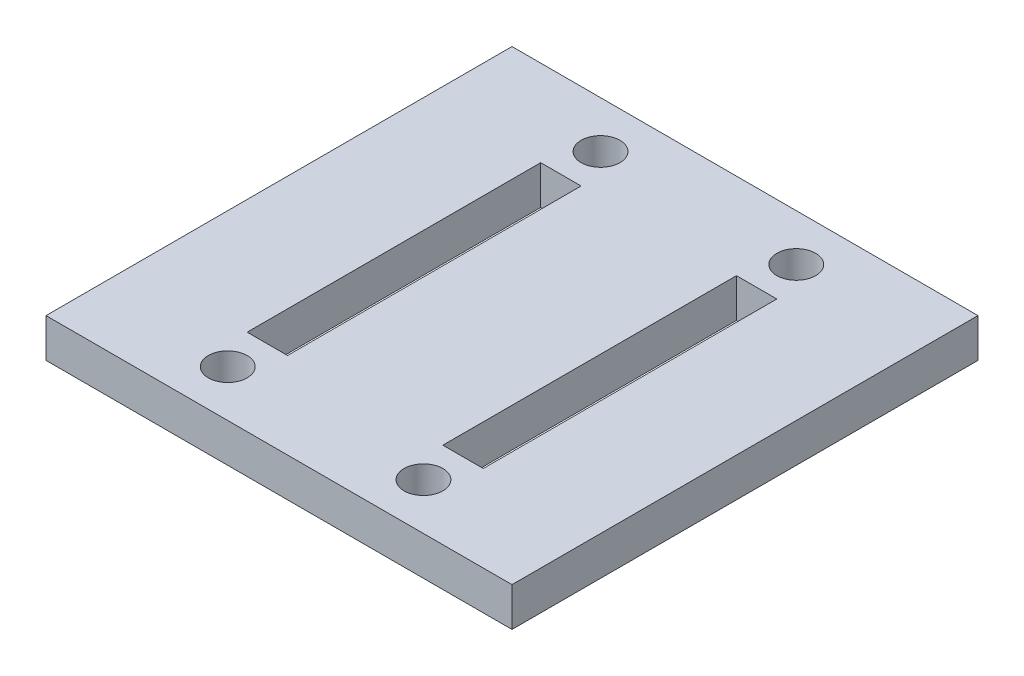
ISO-10303-21;
HEADER;
FILE_DESCRIPTION(('STEP AP214'),'2;1');
FILE_NAME('part.step','',(''),(''),'','','');
FILE_SCHEMA(('AUTOMOTIVE_DESIGN { 1 0 10303 214 1 1 1 1 }'));
ENDSEC;
DATA;
#1=APPLICATION_CONTEXT('core data for automotive mechanical design processes');
#2=APPLICATION_PROTOCOL_DEFINITION('international standard','automotive_design',2000,#1);
#3=PRODUCT_CONTEXT('',#1,'mechanical');
#4=PRODUCT('Part','Part','',(#3));
#5=PRODUCT_RELATED_PRODUCT_CATEGORY('part','',(#4));
#6=PRODUCT_DEFINITION_FORMATION('','',#4);
#7=PRODUCT_DEFINITION_CONTEXT('part definition',#1,'design');
#8=PRODUCT_DEFINITION('design','',#6,#7);
#9=PRODUCT_DEFINITION_SHAPE('','',#8);
#10=(LENGTH_UNIT() NAMED_UNIT(*) SI_UNIT(.MILLI.,.METRE.));
#11=(NAMED_UNIT(*) PLANE_ANGLE_UNIT() SI_UNIT($,.RADIAN.));
#12=(NAMED_UNIT(*) SI_UNIT($,.STERADIAN.) SOLID_ANGLE_UNIT());
#13=UNCERTAINTY_MEASURE_WITH_UNIT(LENGTH_MEASURE(1.E-05),#10,'distance_accuracy_value','');
#14=(GEOMETRIC_REPRESENTATION_CONTEXT(3) GLOBAL_UNCERTAINTY_ASSIGNED_CONTEXT((#13)) GLOBAL_UNIT_ASSIGNED_CONTEXT((#10,
#11,#12)) REPRESENTATION_CONTEXT('',''));
#15=CARTESIAN_POINT('',(0.,0.,0.));
#16=DIRECTION('',(0.,0.,1.));
#17=DIRECTION('',(1.,0.,0.));
#18=AXIS2_PLACEMENT_3D('',#15,#16,#17);
#19=CARTESIAN_POINT('',(38.1,6.35,-38.1));
#20=DIRECTION('',(0.,-1.,0.));
#21=DIRECTION('',(0.,0.,-1.));
#22=AXIS2_PLACEMENT_3D('',#19,#20,#21);
#23=PLANE('',#22);
#24=CARTESIAN_POINT('',(16.002,6.35,30.48));
#25=DIRECTION('',(0.,1.,0.));
#26=DIRECTION('',(0.,0.,1.));
#27=AXIS2_PLACEMENT_3D('',#24,#25,#26);
#28=CIRCLE('',#27,3.175);
#29=CARTESIAN_POINT('',(16.002,6.35,33.655));
#30=VERTEX_POINT('',#29);
#31=EDGE_CURVE('E327',#30,#30,#28,.T.);
#32=ORIENTED_EDGE('',*,*,#31,.F.);
#33=EDGE_LOOP('',(#32));
#34=FACE_BOUND('',#33,.T.);
#35=CARTESIAN_POINT('',(-16.002,6.35,-30.48));
#36=DIRECTION('',(0.,1.,0.));
#37=DIRECTION('',(0.,0.,1.));
#38=AXIS2_PLACEMENT_3D('',#35,#36,#37);
#39=CIRCLE('',#38,3.175);
#40=CARTESIAN_POINT('',(-16.002,6.35,-27.305));
#41=VERTEX_POINT('',#40);
#42=EDGE_CURVE('E150',#41,#41,#39,.T.);
#43=ORIENTED_EDGE('',*,*,#42,.F.);
#44=EDGE_LOOP('',(#43));
#45=FACE_BOUND('',#44,.T.);
#46=DIRECTION('',(0.,0.,-1.));
#47=VECTOR('',#46,1.);
#48=CARTESIAN_POINT('',(19.304,6.35,24.003));
#49=LINE('',#48,#47);
#50=CARTESIAN_POINT('',(19.304,6.35,24.003));
#51=VERTEX_POINT('',#50);
#52=CARTESIAN_POINT('',(19.304,6.35,-24.003));
#53=VERTEX_POINT('',#52);
#54=EDGE_CURVE('E160',#51,#53,#49,.T.);
#55=ORIENTED_EDGE('',*,*,#54,.F.);
#56=DIRECTION('',(1.,0.,0.));
#57=VECTOR('',#56,1.);
#58=CARTESIAN_POINT('',(12.7,6.35,24.003));
#59=LINE('',#58,#57);
#60=CARTESIAN_POINT('',(12.7,6.35,24.003));
#61=VERTEX_POINT('',#60);
#62=EDGE_CURVE('E168',#61,#51,#59,.T.);
#63=ORIENTED_EDGE('',*,*,#62,.F.);
#64=DIRECTION('',(0.,0.,1.));
#65=VECTOR('',#64,1.);
#66=CARTESIAN_POINT('',(12.7,6.35,24.003));
#67=LINE('',#66,#65);
#68=CARTESIAN_POINT('',(12.7,6.35,-24.003));
#69=VERTEX_POINT('',#68);
#70=EDGE_CURVE('E165',#69,#61,#67,.T.);
#71=ORIENTED_EDGE('',*,*,#70,.F.);
#72=DIRECTION('',(-1.,0.,0.));
#73=VECTOR('',#72,1.);
#74=CARTESIAN_POINT('',(12.7,6.35,-24.003));
#75=LINE('',#74,#73);
#76=EDGE_CURVE('E162',#53,#69,#75,.T.);
#77=ORIENTED_EDGE('',*,*,#76,.F.);
#78=EDGE_LOOP('',(#55,#63,#71,#77));
#79=FACE_BOUND('',#78,.T.);
#80=DIRECTION('',(0.,0.,-1.));
#81=VECTOR('',#80,1.);
#82=CARTESIAN_POINT('',(38.1,6.35,38.1));
#83=LINE('',#82,#81);
#84=CARTESIAN_POINT('',(38.1,6.35,38.1));
#85=VERTEX_POINT('',#84);
#86=CARTESIAN_POINT('',(38.1,6.35,-38.1));
#87=VERTEX_POINT('',#86);
#88=EDGE_CURVE('E191',#85,#87,#83,.T.);
#89=ORIENTED_EDGE('',*,*,#88,.T.);
#90=DIRECTION('',(-1.,0.,0.));
#91=VECTOR('',#90,1.);
#92=CARTESIAN_POINT('',(-38.1,6.35,-38.1));
#93=LINE('',#92,#91);
#94=CARTESIAN_POINT('',(-38.1,6.35,-38.1));
#95=VERTEX_POINT('',#94);
#96=EDGE_CURVE('E194',#87,#95,#93,.T.);
#97=ORIENTED_EDGE('',*,*,#96,.T.);
#98=DIRECTION('',(0.,0.,1.));
#99=VECTOR('',#98,1.);
#100=CARTESIAN_POINT('',(-38.1,6.35,38.1));
#101=LINE('',#100,#99);
#102=CARTESIAN_POINT('',(-38.1,6.35,38.1));
#103=VERTEX_POINT('',#102);
#104=EDGE_CURVE('E197',#95,#103,#101,.T.);
#105=ORIENTED_EDGE('',*,*,#104,.T.);
#106=DIRECTION('',(1.,0.,0.));
#107=VECTOR('',#106,1.);
#108=CARTESIAN_POINT('',(-38.1,6.35,38.1));
#109=LINE('',#108,#107);
#110=EDGE_CURVE('E199',#103,#85,#109,.T.);
#111=ORIENTED_EDGE('',*,*,#110,.T.);
#112=EDGE_LOOP('',(#89,#97,#105,#111));
#113=FACE_BOUND('',#112,.T.);
#114=DIRECTION('',(0.,0.,-1.));
#115=VECTOR('',#114,1.);
#116=CARTESIAN_POINT('',(-12.7,6.35,24.003));
#117=LINE('',#116,#115);
#118=CARTESIAN_POINT('',(-12.7,6.35,24.003));
#119=VERTEX_POINT('',#118);
#120=CARTESIAN_POINT('',(-12.7,6.35,-24.003));
#121=VERTEX_POINT('',#120);
#122=EDGE_CURVE('E121',#119,#121,#117,.T.);
#123=ORIENTED_EDGE('',*,*,#122,.F.);
#124=DIRECTION('',(1.,0.,0.));
#125=VECTOR('',#124,1.);
#126=CARTESIAN_POINT('',(-12.7,6.35,24.003));
#127=LINE('',#126,#125);
#128=CARTESIAN_POINT('',(-19.304,6.35,24.003));
#129=VERTEX_POINT('',#128);
#130=EDGE_CURVE('E144',#129,#119,#127,.T.);
#131=ORIENTED_EDGE('',*,*,#130,.F.);
#132=DIRECTION('',(0.,0.,1.));
#133=VECTOR('',#132,1.);
#134=CARTESIAN_POINT('',(-19.304,6.35,24.003));
#135=LINE('',#134,#133);
#136=CARTESIAN_POINT('',(-19.304,6.35,-24.003));
#137=VERTEX_POINT('',#136);
#138=EDGE_CURVE('E142',#137,#129,#135,.T.);
#139=ORIENTED_EDGE('',*,*,#138,.F.);
#140=DIRECTION('',(-1.,0.,0.));
#141=VECTOR('',#140,1.);
#142=CARTESIAN_POINT('',(-12.7,6.35,-24.003));
#143=LINE('',#142,#141);
#144=EDGE_CURVE('E129',#121,#137,#143,.T.);
#145=ORIENTED_EDGE('',*,*,#144,.F.);
#146=EDGE_LOOP('',(#123,#131,#139,#145));
#147=FACE_BOUND('',#146,.T.);
#148=CARTESIAN_POINT('',(-16.002,6.35,30.48));
#149=DIRECTION('',(0.,1.,0.));
#150=DIRECTION('',(0.,0.,-1.));
#151=AXIS2_PLACEMENT_3D('',#148,#149,#150);
#152=CIRCLE('',#151,3.175);
#153=CARTESIAN_POINT('',(-16.002,6.35,27.305));
#154=VERTEX_POINT('',#153);
#155=EDGE_CURVE('E333',#154,#154,#152,.T.);
#156=ORIENTED_EDGE('',*,*,#155,.F.);
#157=EDGE_LOOP('',(#156));
#158=FACE_BOUND('',#157,.T.);
#159=CARTESIAN_POINT('',(16.002,6.35,-30.48));
#160=DIRECTION('',(0.,1.,0.));
#161=DIRECTION('',(0.,0.,-1.));
#162=AXIS2_PLACEMENT_3D('',#159,#160,#161);
#163=CIRCLE('',#162,3.175);
#164=CARTESIAN_POINT('',(16.002,6.35,-33.655));
#165=VERTEX_POINT('',#164);
#166=EDGE_CURVE('E318',#165,#165,#163,.T.);
#167=ORIENTED_EDGE('',*,*,#166,.F.);
#168=EDGE_LOOP('',(#167));
#169=FACE_BOUND('',#168,.T.);
#170=ADVANCED_FACE('F32',(#34,#45,#79,#113,#147,#158,#169),#23,.F.);
#171=CARTESIAN_POINT('',(38.1,0.,-38.1));
#172=DIRECTION('',(0.,-1.,0.));
#173=DIRECTION('',(0.,0.,-1.));
#174=AXIS2_PLACEMENT_3D('',#171,#172,#173);
#175=PLANE('',#174);
#176=CARTESIAN_POINT('',(16.002,0.,30.48));
#177=DIRECTION('',(0.,1.,0.));
#178=DIRECTION('',(0.,0.,1.));
#179=AXIS2_PLACEMENT_3D('',#176,#177,#178);
#180=CIRCLE('',#179,3.175);
#181=CARTESIAN_POINT('',(16.002,0.,33.655));
#182=VERTEX_POINT('',#181);
#183=EDGE_CURVE('E324',#182,#182,#180,.T.);
#184=ORIENTED_EDGE('',*,*,#183,.T.);
#185=EDGE_LOOP('',(#184));
#186=FACE_BOUND('',#185,.T.);
#187=CARTESIAN_POINT('',(-16.002,0.,-30.48));
#188=DIRECTION('',(0.,1.,0.));
#189=DIRECTION('',(0.,0.,1.));
#190=AXIS2_PLACEMENT_3D('',#187,#188,#189);
#191=CIRCLE('',#190,3.175);
#192=CARTESIAN_POINT('',(-16.002,0.,-27.305));
#193=VERTEX_POINT('',#192);
#194=EDGE_CURVE('E336',#193,#193,#191,.T.);
#195=ORIENTED_EDGE('',*,*,#194,.T.);
#196=EDGE_LOOP('',(#195));
#197=FACE_BOUND('',#196,.T.);
#198=DIRECTION('',(1.,0.,0.));
#199=VECTOR('',#198,1.);
#200=CARTESIAN_POINT('',(12.7,0.,24.003));
#201=LINE('',#200,#199);
#202=CARTESIAN_POINT('',(12.7,0.,24.003));
#203=VERTEX_POINT('',#202);
#204=CARTESIAN_POINT('',(19.304,0.,24.003));
#205=VERTEX_POINT('',#204);
#206=EDGE_CURVE('E163',#203,#205,#201,.T.);
#207=ORIENTED_EDGE('',*,*,#206,.T.);
#208=DIRECTION('',(0.,0.,-1.));
#209=VECTOR('',#208,1.);
#210=CARTESIAN_POINT('',(19.304,0.,24.003));
#211=LINE('',#210,#209);
#212=CARTESIAN_POINT('',(19.304,0.,-24.003));
#213=VERTEX_POINT('',#212);
#214=EDGE_CURVE('E137',#205,#213,#211,.T.);
#215=ORIENTED_EDGE('',*,*,#214,.T.);
#216=DIRECTION('',(-1.,0.,0.));
#217=VECTOR('',#216,1.);
#218=CARTESIAN_POINT('',(12.7,0.,-24.003));
#219=LINE('',#218,#217);
#220=CARTESIAN_POINT('',(12.7,0.,-24.003));
#221=VERTEX_POINT('',#220);
#222=EDGE_CURVE('E173',#213,#221,#219,.T.);
#223=ORIENTED_EDGE('',*,*,#222,.T.);
#224=DIRECTION('',(0.,0.,1.));
#225=VECTOR('',#224,1.);
#226=CARTESIAN_POINT('',(12.7,0.,24.003));
#227=LINE('',#226,#225);
#228=EDGE_CURVE('E176',#221,#203,#227,.T.);
#229=ORIENTED_EDGE('',*,*,#228,.T.);
#230=EDGE_LOOP('',(#207,#215,#223,#229));
#231=FACE_BOUND('',#230,.T.);
#232=DIRECTION('',(0.,0.,-1.));
#233=VECTOR('',#232,1.);
#234=CARTESIAN_POINT('',(38.1,0.,38.1));
#235=LINE('',#234,#233);
#236=CARTESIAN_POINT('',(38.1,0.,38.1));
#237=VERTEX_POINT('',#236);
#238=CARTESIAN_POINT('',(38.1,0.,-38.1));
#239=VERTEX_POINT('',#238);
#240=EDGE_CURVE('E190',#237,#239,#235,.T.);
#241=ORIENTED_EDGE('',*,*,#240,.F.);
#242=DIRECTION('',(1.,0.,0.));
#243=VECTOR('',#242,1.);
#244=CARTESIAN_POINT('',(-38.1,0.,38.1));
#245=LINE('',#244,#243);
#246=CARTESIAN_POINT('',(-38.1,0.,38.1));
#247=VERTEX_POINT('',#246);
#248=EDGE_CURVE('E195',#247,#237,#245,.T.);
#249=ORIENTED_EDGE('',*,*,#248,.F.);
#250=DIRECTION('',(0.,0.,1.));
#251=VECTOR('',#250,1.);
#252=CARTESIAN_POINT('',(-38.1,0.,38.1));
#253=LINE('',#252,#251);
#254=CARTESIAN_POINT('',(-38.1,0.,-38.1));
#255=VERTEX_POINT('',#254);
#256=EDGE_CURVE('E206',#255,#247,#253,.T.);
#257=ORIENTED_EDGE('',*,*,#256,.F.);
#258=DIRECTION('',(-1.,0.,0.));
#259=VECTOR('',#258,1.);
#260=CARTESIAN_POINT('',(-38.1,0.,-38.1));
#261=LINE('',#260,#259);
#262=EDGE_CURVE('E204',#239,#255,#261,.T.);
#263=ORIENTED_EDGE('',*,*,#262,.F.);
#264=EDGE_LOOP('',(#241,#249,#257,#263));
#265=FACE_BOUND('',#264,.T.);
#266=DIRECTION('',(1.,0.,0.));
#267=VECTOR('',#266,1.);
#268=CARTESIAN_POINT('',(-12.7,0.,24.003));
#269=LINE('',#268,#267);
#270=CARTESIAN_POINT('',(-19.304,0.,24.003));
#271=VERTEX_POINT('',#270);
#272=CARTESIAN_POINT('',(-12.7,0.,24.003));
#273=VERTEX_POINT('',#272);
#274=EDGE_CURVE('E130',#271,#273,#269,.T.);
#275=ORIENTED_EDGE('',*,*,#274,.T.);
#276=DIRECTION('',(0.,0.,-1.));
#277=VECTOR('',#276,1.);
#278=CARTESIAN_POINT('',(-12.7,0.,24.003));
#279=LINE('',#278,#277);
#280=CARTESIAN_POINT('',(-12.7,0.,-24.003));
#281=VERTEX_POINT('',#280);
#282=EDGE_CURVE('E55',#273,#281,#279,.T.);
#283=ORIENTED_EDGE('',*,*,#282,.T.);
#284=DIRECTION('',(-1.,0.,0.));
#285=VECTOR('',#284,1.);
#286=CARTESIAN_POINT('',(-12.7,0.,-24.003));
#287=LINE('',#286,#285);
#288=CARTESIAN_POINT('',(-19.304,0.,-24.003));
#289=VERTEX_POINT('',#288);
#290=EDGE_CURVE('E136',#281,#289,#287,.T.);
#291=ORIENTED_EDGE('',*,*,#290,.T.);
#292=DIRECTION('',(0.,0.,1.));
#293=VECTOR('',#292,1.);
#294=CARTESIAN_POINT('',(-19.304,0.,24.003));
#295=LINE('',#294,#293);
#296=EDGE_CURVE('E152',#289,#271,#295,.T.);
#297=ORIENTED_EDGE('',*,*,#296,.T.);
#298=EDGE_LOOP('',(#275,#283,#291,#297));
#299=FACE_BOUND('',#298,.T.);
#300=CARTESIAN_POINT('',(-16.002,0.,30.48));
#301=DIRECTION('',(0.,1.,0.));
#302=DIRECTION('',(0.,0.,-1.));
#303=AXIS2_PLACEMENT_3D('',#300,#301,#302);
#304=CIRCLE('',#303,3.175);
#305=CARTESIAN_POINT('',(-16.002,0.,27.305));
#306=VERTEX_POINT('',#305);
#307=EDGE_CURVE('E330',#306,#306,#304,.T.);
#308=ORIENTED_EDGE('',*,*,#307,.T.);
#309=EDGE_LOOP('',(#308));
#310=FACE_BOUND('',#309,.T.);
#311=CARTESIAN_POINT('',(16.002,0.,-30.48));
#312=DIRECTION('',(0.,1.,0.));
#313=DIRECTION('',(0.,0.,-1.));
#314=AXIS2_PLACEMENT_3D('',#311,#312,#313);
#315=CIRCLE('',#314,3.175);
#316=CARTESIAN_POINT('',(16.002,0.,-33.655));
#317=VERTEX_POINT('',#316);
#318=EDGE_CURVE('E321',#317,#317,#315,.T.);
#319=ORIENTED_EDGE('',*,*,#318,.T.);
#320=EDGE_LOOP('',(#319));
#321=FACE_BOUND('',#320,.T.);
#322=ADVANCED_FACE('F224',(#186,#197,#231,#265,#299,#310,#321),#175,.T.);
#323=CARTESIAN_POINT('',(38.1,6.35,38.1));
#324=DIRECTION('',(-1.,0.,0.));
#325=DIRECTION('',(0.,0.,1.));
#326=AXIS2_PLACEMENT_3D('',#323,#324,#325);
#327=PLANE('',#326);
#328=ORIENTED_EDGE('',*,*,#240,.T.);
#329=DIRECTION('',(0.,-1.,0.));
#330=VECTOR('',#329,1.);
#331=CARTESIAN_POINT('',(38.1,6.35,-38.1));
#332=LINE('',#331,#330);
#333=EDGE_CURVE('E11',#87,#239,#332,.T.);
#334=ORIENTED_EDGE('',*,*,#333,.F.);
#335=ORIENTED_EDGE('',*,*,#88,.F.);
#336=DIRECTION('',(0.,-1.,0.));
#337=VECTOR('',#336,1.);
#338=CARTESIAN_POINT('',(38.1,6.35,38.1));
#339=LINE('',#338,#337);
#340=EDGE_CURVE('E201',#85,#237,#339,.T.);
#341=ORIENTED_EDGE('',*,*,#340,.T.);
#342=EDGE_LOOP('',(#328,#334,#335,#341));
#343=FACE_BOUND('',#342,.T.);
#344=ADVANCED_FACE('F34',(#343),#327,.F.);
#345=CARTESIAN_POINT('',(-38.1,6.35,-38.1));
#346=DIRECTION('',(0.,0.,1.));
#347=DIRECTION('',(1.,0.,0.));
#348=AXIS2_PLACEMENT_3D('',#345,#346,#347);
#349=PLANE('',#348);
#350=ORIENTED_EDGE('',*,*,#262,.T.);
#351=DIRECTION('',(0.,-1.,0.));
#352=VECTOR('',#351,1.);
#353=CARTESIAN_POINT('',(-38.1,6.35,-38.1));
#354=LINE('',#353,#352);
#355=EDGE_CURVE('E40',#95,#255,#354,.T.);
#356=ORIENTED_EDGE('',*,*,#355,.F.);
#357=ORIENTED_EDGE('',*,*,#96,.F.);
#358=ORIENTED_EDGE('',*,*,#333,.T.);
#359=EDGE_LOOP('',(#350,#356,#357,#358));
#360=FACE_BOUND('',#359,.T.);
#361=ADVANCED_FACE('F234',(#360),#349,.F.);
#362=CARTESIAN_POINT('',(-38.1,6.35,38.1));
#363=DIRECTION('',(1.,0.,0.));
#364=DIRECTION('',(0.,0.,-1.));
#365=AXIS2_PLACEMENT_3D('',#362,#363,#364);
#366=PLANE('',#365);
#367=ORIENTED_EDGE('',*,*,#256,.T.);
#368=DIRECTION('',(0.,-1.,0.));
#369=VECTOR('',#368,1.);
#370=CARTESIAN_POINT('',(-38.1,6.35,38.1));
#371=LINE('',#370,#369);
#372=EDGE_CURVE('E211',#103,#247,#371,.T.);
#373=ORIENTED_EDGE('',*,*,#372,.F.);
#374=ORIENTED_EDGE('',*,*,#104,.F.);
#375=ORIENTED_EDGE('',*,*,#355,.T.);
#376=EDGE_LOOP('',(#367,#373,#374,#375));
#377=FACE_BOUND('',#376,.T.);
#378=ADVANCED_FACE('F218',(#377),#366,.F.);
#379=CARTESIAN_POINT('',(-38.1,6.35,38.1));
#380=DIRECTION('',(0.,0.,-1.));
#381=DIRECTION('',(-1.,0.,0.));
#382=AXIS2_PLACEMENT_3D('',#379,#380,#381);
#383=PLANE('',#382);
#384=ORIENTED_EDGE('',*,*,#248,.T.);
#385=ORIENTED_EDGE('',*,*,#340,.F.);
#386=ORIENTED_EDGE('',*,*,#110,.F.);
#387=ORIENTED_EDGE('',*,*,#372,.T.);
#388=EDGE_LOOP('',(#384,#385,#386,#387));
#389=FACE_BOUND('',#388,.T.);
#390=ADVANCED_FACE('F228',(#389),#383,.F.);
#391=CARTESIAN_POINT('',(19.304,6.35,24.003));
#392=DIRECTION('',(-1.,0.,0.));
#393=DIRECTION('',(0.,0.,1.));
#394=AXIS2_PLACEMENT_3D('',#391,#392,#393);
#395=PLANE('',#394);
#396=ORIENTED_EDGE('',*,*,#214,.F.);
#397=DIRECTION('',(0.,-1.,0.));
#398=VECTOR('',#397,1.);
#399=CARTESIAN_POINT('',(19.304,6.35,24.003));
#400=LINE('',#399,#398);
#401=EDGE_CURVE('E170',#51,#205,#400,.T.);
#402=ORIENTED_EDGE('',*,*,#401,.F.);
#403=ORIENTED_EDGE('',*,*,#54,.T.);
#404=DIRECTION('',(0.,-1.,0.));
#405=VECTOR('',#404,1.);
#406=CARTESIAN_POINT('',(19.304,6.35,-24.003));
#407=LINE('',#406,#405);
#408=EDGE_CURVE('E187',#53,#213,#407,.T.);
#409=ORIENTED_EDGE('',*,*,#408,.T.);
#410=EDGE_LOOP('',(#396,#402,#403,#409));
#411=FACE_BOUND('',#410,.T.);
#412=ADVANCED_FACE('F252',(#411),#395,.T.);
#413=CARTESIAN_POINT('',(12.7,6.35,-24.003));
#414=DIRECTION('',(0.,0.,1.));
#415=DIRECTION('',(1.,0.,0.));
#416=AXIS2_PLACEMENT_3D('',#413,#414,#415);
#417=PLANE('',#416);
#418=ORIENTED_EDGE('',*,*,#222,.F.);
#419=ORIENTED_EDGE('',*,*,#408,.F.);
#420=ORIENTED_EDGE('',*,*,#76,.T.);
#421=DIRECTION('',(0.,-1.,0.));
#422=VECTOR('',#421,1.);
#423=CARTESIAN_POINT('',(12.7,6.35,-24.003));
#424=LINE('',#423,#422);
#425=EDGE_CURVE('E185',#69,#221,#424,.T.);
#426=ORIENTED_EDGE('',*,*,#425,.T.);
#427=EDGE_LOOP('',(#418,#419,#420,#426));
#428=FACE_BOUND('',#427,.T.);
#429=ADVANCED_FACE('F259',(#428),#417,.T.);
#430=CARTESIAN_POINT('',(12.7,6.35,24.003));
#431=DIRECTION('',(1.,0.,0.));
#432=DIRECTION('',(0.,0.,-1.));
#433=AXIS2_PLACEMENT_3D('',#430,#431,#432);
#434=PLANE('',#433);
#435=ORIENTED_EDGE('',*,*,#228,.F.);
#436=ORIENTED_EDGE('',*,*,#425,.F.);
#437=ORIENTED_EDGE('',*,*,#70,.T.);
#438=DIRECTION('',(0.,-1.,0.));
#439=VECTOR('',#438,1.);
#440=CARTESIAN_POINT('',(12.7,6.35,24.003));
#441=LINE('',#440,#439);
#442=EDGE_CURVE('E183',#61,#203,#441,.T.);
#443=ORIENTED_EDGE('',*,*,#442,.T.);
#444=EDGE_LOOP('',(#435,#436,#437,#443));
#445=FACE_BOUND('',#444,.T.);
#446=ADVANCED_FACE('F264',(#445),#434,.T.);
#447=CARTESIAN_POINT('',(12.7,6.35,24.003));
#448=DIRECTION('',(0.,0.,-1.));
#449=DIRECTION('',(-1.,0.,0.));
#450=AXIS2_PLACEMENT_3D('',#447,#448,#449);
#451=PLANE('',#450);
#452=ORIENTED_EDGE('',*,*,#206,.F.);
#453=ORIENTED_EDGE('',*,*,#442,.F.);
#454=ORIENTED_EDGE('',*,*,#62,.T.);
#455=ORIENTED_EDGE('',*,*,#401,.T.);
#456=EDGE_LOOP('',(#452,#453,#454,#455));
#457=FACE_BOUND('',#456,.T.);
#458=ADVANCED_FACE('F272',(#457),#451,.T.);
#459=CARTESIAN_POINT('',(-12.7,6.35,24.003));
#460=DIRECTION('',(-1.,0.,0.));
#461=DIRECTION('',(0.,0.,1.));
#462=AXIS2_PLACEMENT_3D('',#459,#460,#461);
#463=PLANE('',#462);
#464=ORIENTED_EDGE('',*,*,#282,.F.);
#465=DIRECTION('',(0.,-1.,0.));
#466=VECTOR('',#465,1.);
#467=CARTESIAN_POINT('',(-12.7,6.35,24.003));
#468=LINE('',#467,#466);
#469=EDGE_CURVE('E125',#119,#273,#468,.T.);
#470=ORIENTED_EDGE('',*,*,#469,.F.);
#471=ORIENTED_EDGE('',*,*,#122,.T.);
#472=DIRECTION('',(0.,-1.,0.));
#473=VECTOR('',#472,1.);
#474=CARTESIAN_POINT('',(-12.7,6.35,-24.003));
#475=LINE('',#474,#473);
#476=EDGE_CURVE('E124',#121,#281,#475,.T.);
#477=ORIENTED_EDGE('',*,*,#476,.T.);
#478=EDGE_LOOP('',(#464,#470,#471,#477));
#479=FACE_BOUND('',#478,.T.);
#480=ADVANCED_FACE('F123',(#479),#463,.T.);
#481=CARTESIAN_POINT('',(-12.7,6.35,-24.003));
#482=DIRECTION('',(0.,0.,1.));
#483=DIRECTION('',(1.,0.,0.));
#484=AXIS2_PLACEMENT_3D('',#481,#482,#483);
#485=PLANE('',#484);
#486=ORIENTED_EDGE('',*,*,#290,.F.);
#487=ORIENTED_EDGE('',*,*,#476,.F.);
#488=ORIENTED_EDGE('',*,*,#144,.T.);
#489=DIRECTION('',(0.,-1.,0.));
#490=VECTOR('',#489,1.);
#491=CARTESIAN_POINT('',(-19.304,6.35,-24.003));
#492=LINE('',#491,#490);
#493=EDGE_CURVE('E138',#137,#289,#492,.T.);
#494=ORIENTED_EDGE('',*,*,#493,.T.);
#495=EDGE_LOOP('',(#486,#487,#488,#494));
#496=FACE_BOUND('',#495,.T.);
#497=ADVANCED_FACE('F133',(#496),#485,.T.);
#498=CARTESIAN_POINT('',(-19.304,6.35,24.003));
#499=DIRECTION('',(1.,0.,0.));
#500=DIRECTION('',(0.,0.,-1.));
#501=AXIS2_PLACEMENT_3D('',#498,#499,#500);
#502=PLANE('',#501);
#503=ORIENTED_EDGE('',*,*,#296,.F.);
#504=ORIENTED_EDGE('',*,*,#493,.F.);
#505=ORIENTED_EDGE('',*,*,#138,.T.);
#506=DIRECTION('',(0.,-1.,0.));
#507=VECTOR('',#506,1.);
#508=CARTESIAN_POINT('',(-19.304,6.35,24.003));
#509=LINE('',#508,#507);
#510=EDGE_CURVE('E47',#129,#271,#509,.T.);
#511=ORIENTED_EDGE('',*,*,#510,.T.);
#512=EDGE_LOOP('',(#503,#504,#505,#511));
#513=FACE_BOUND('',#512,.T.);
#514=ADVANCED_FACE('F291',(#513),#502,.T.);
#515=CARTESIAN_POINT('',(-12.7,6.35,24.003));
#516=DIRECTION('',(0.,0.,-1.));
#517=DIRECTION('',(-1.,0.,0.));
#518=AXIS2_PLACEMENT_3D('',#515,#516,#517);
#519=PLANE('',#518);
#520=ORIENTED_EDGE('',*,*,#274,.F.);
#521=ORIENTED_EDGE('',*,*,#510,.F.);
#522=ORIENTED_EDGE('',*,*,#130,.T.);
#523=ORIENTED_EDGE('',*,*,#469,.T.);
#524=EDGE_LOOP('',(#520,#521,#522,#523));
#525=FACE_BOUND('',#524,.T.);
#526=ADVANCED_FACE('F294',(#525),#519,.T.);
#527=CARTESIAN_POINT('',(-16.002,6.35,-30.48));
#528=DIRECTION('',(0.,-1.,0.));
#529=DIRECTION('',(0.,0.,-1.));
#530=AXIS2_PLACEMENT_3D('',#527,#528,#529);
#531=CYLINDRICAL_SURFACE('',#530,3.175);
#532=ORIENTED_EDGE('',*,*,#42,.T.);
#533=EDGE_LOOP('',(#532));
#534=FACE_BOUND('',#533,.T.);
#535=ORIENTED_EDGE('',*,*,#194,.F.);
#536=EDGE_LOOP('',(#535));
#537=FACE_BOUND('',#536,.T.);
#538=ADVANCED_FACE('F298',(#534,#537),#531,.F.);
#539=CARTESIAN_POINT('',(-16.002,6.35,30.48));
#540=DIRECTION('',(0.,-1.,0.));
#541=DIRECTION('',(0.,0.,-1.));
#542=AXIS2_PLACEMENT_3D('',#539,#540,#541);
#543=CYLINDRICAL_SURFACE('',#542,3.175);
#544=ORIENTED_EDGE('',*,*,#155,.T.);
#545=EDGE_LOOP('',(#544));
#546=FACE_BOUND('',#545,.T.);
#547=ORIENTED_EDGE('',*,*,#307,.F.);
#548=EDGE_LOOP('',(#547));
#549=FACE_BOUND('',#548,.T.);
#550=ADVANCED_FACE('F301',(#546,#549),#543,.F.);
#551=CARTESIAN_POINT('',(16.002,6.35,30.48));
#552=DIRECTION('',(0.,-1.,0.));
#553=DIRECTION('',(0.,0.,-1.));
#554=AXIS2_PLACEMENT_3D('',#551,#552,#553);
#555=CYLINDRICAL_SURFACE('',#554,3.175);
#556=ORIENTED_EDGE('',*,*,#31,.T.);
#557=EDGE_LOOP('',(#556));
#558=FACE_BOUND('',#557,.T.);
#559=ORIENTED_EDGE('',*,*,#183,.F.);
#560=EDGE_LOOP('',(#559));
#561=FACE_BOUND('',#560,.T.);
#562=ADVANCED_FACE('F305',(#558,#561),#555,.F.);
#563=CARTESIAN_POINT('',(16.002,6.35,-30.48));
#564=DIRECTION('',(0.,-1.,0.));
#565=DIRECTION('',(0.,0.,-1.));
#566=AXIS2_PLACEMENT_3D('',#563,#564,#565);
#567=CYLINDRICAL_SURFACE('',#566,3.175);
#568=ORIENTED_EDGE('',*,*,#166,.T.);
#569=EDGE_LOOP('',(#568));
#570=FACE_BOUND('',#569,.T.);
#571=ORIENTED_EDGE('',*,*,#318,.F.);
#572=EDGE_LOOP('',(#571));
#573=FACE_BOUND('',#572,.T.);
#574=ADVANCED_FACE('F309',(#570,#573),#567,.F.);
#575=CLOSED_SHELL('',(#170,#322,#344,#361,#378,#390,#412,#429,#446,#458,#480,#497,#514,#526,
#538,#550,#562,#574));
#576=MANIFOLD_SOLID_BREP('B2',#575);
#577=ADVANCED_BREP_SHAPE_REPRESENTATION('',(#18,#576),#14);
#578=SHAPE_DEFINITION_REPRESENTATION(#9,#577);
ENDSEC;
END-ISO-10303-21;
